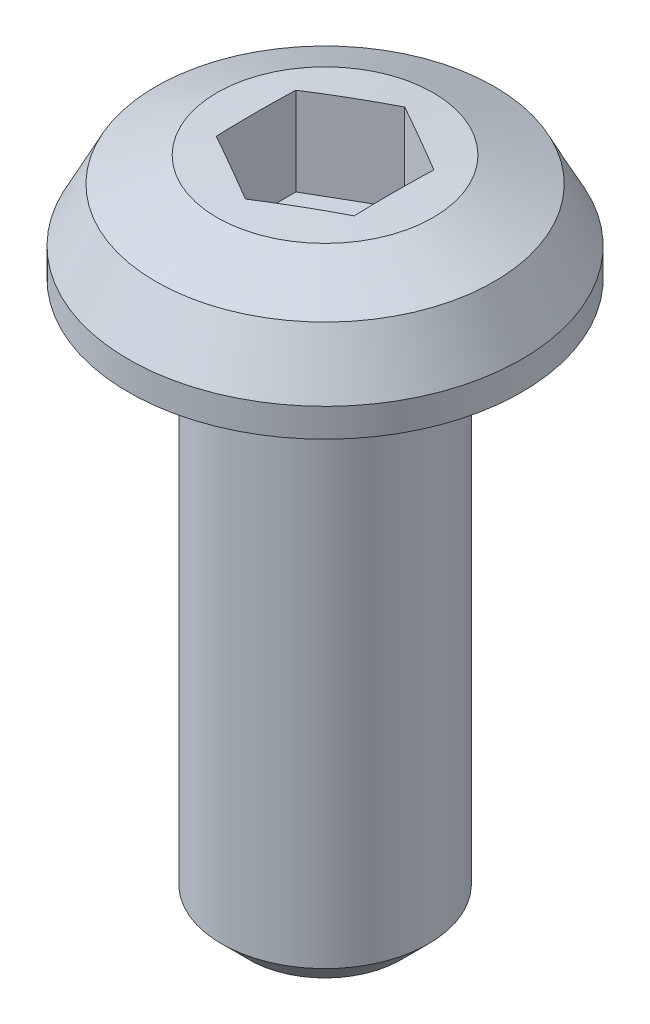
ISO-10303-21;
HEADER;
FILE_DESCRIPTION(('STEP AP214'),'2;1');
FILE_NAME('part.step','',(''),(''),'','','');
FILE_SCHEMA(('AUTOMOTIVE_DESIGN { 1 0 10303 214 1 1 1 1 }'));
ENDSEC;
DATA;
#1=APPLICATION_CONTEXT('core data for automotive mechanical design processes');
#2=APPLICATION_PROTOCOL_DEFINITION('international standard','automotive_design',2000,#1);
#3=PRODUCT_CONTEXT('',#1,'mechanical');
#4=PRODUCT('Part','Part','',(#3));
#5=PRODUCT_RELATED_PRODUCT_CATEGORY('part','',(#4));
#6=PRODUCT_DEFINITION_FORMATION('','',#4);
#7=PRODUCT_DEFINITION_CONTEXT('part definition',#1,'design');
#8=PRODUCT_DEFINITION('design','',#6,#7);
#9=PRODUCT_DEFINITION_SHAPE('','',#8);
#10=(LENGTH_UNIT() NAMED_UNIT(*) SI_UNIT(.MILLI.,.METRE.));
#11=(NAMED_UNIT(*) PLANE_ANGLE_UNIT() SI_UNIT($,.RADIAN.));
#12=(NAMED_UNIT(*) SI_UNIT($,.STERADIAN.) SOLID_ANGLE_UNIT());
#13=UNCERTAINTY_MEASURE_WITH_UNIT(LENGTH_MEASURE(1.E-05),#10,'distance_accuracy_value','');
#14=(GEOMETRIC_REPRESENTATION_CONTEXT(3) GLOBAL_UNCERTAINTY_ASSIGNED_CONTEXT((#13)) GLOBAL_UNIT_ASSIGNED_CONTEXT((#10,
#11,#12)) REPRESENTATION_CONTEXT('',''));
#15=CARTESIAN_POINT('',(0.,0.,0.));
#16=DIRECTION('',(0.,0.,1.));
#17=DIRECTION('',(1.,0.,0.));
#18=AXIS2_PLACEMENT_3D('',#15,#16,#17);
#19=CARTESIAN_POINT('',(0.,-8.,0.));
#20=DIRECTION('',(0.,-1.,0.));
#21=DIRECTION('',(0.,0.,-1.));
#22=AXIS2_PLACEMENT_3D('',#19,#20,#21);
#23=PLANE('',#22);
#24=CARTESIAN_POINT('',(0.,-8.,0.));
#25=DIRECTION('',(0.,-1.,0.));
#26=DIRECTION('',(0.,0.,-1.));
#27=AXIS2_PLACEMENT_3D('',#24,#25,#26);
#28=CIRCLE('',#27,1.1);
#29=CARTESIAN_POINT('',(0.,-8.,-1.1));
#30=VERTEX_POINT('',#29);
#31=EDGE_CURVE('E156',#30,#30,#28,.T.);
#32=ORIENTED_EDGE('',*,*,#31,.T.);
#33=EDGE_LOOP('',(#32));
#34=FACE_BOUND('',#33,.T.);
#35=ADVANCED_FACE('F41',(#34),#23,.T.);
#36=CARTESIAN_POINT('',(0.,-8.,0.));
#37=DIRECTION('',(0.,1.,0.));
#38=DIRECTION('',(0.,0.,1.));
#39=AXIS2_PLACEMENT_3D('',#36,#37,#38);
#40=CONICAL_SURFACE('',#39,1.1,0.785398163397448);
#41=CARTESIAN_POINT('',(0.,-7.6,0.));
#42=DIRECTION('',(0.,-1.,0.));
#43=DIRECTION('',(0.,0.,-1.));
#44=AXIS2_PLACEMENT_3D('',#41,#42,#43);
#45=CIRCLE('',#44,1.5);
#46=CARTESIAN_POINT('',(0.,-7.6,-1.5));
#47=VERTEX_POINT('',#46);
#48=EDGE_CURVE('E153',#47,#47,#45,.T.);
#49=ORIENTED_EDGE('',*,*,#48,.T.);
#50=EDGE_LOOP('',(#49));
#51=FACE_BOUND('',#50,.T.);
#52=ORIENTED_EDGE('',*,*,#31,.F.);
#53=EDGE_LOOP('',(#52));
#54=FACE_BOUND('',#53,.T.);
#55=ADVANCED_FACE('F193',(#51,#54),#40,.T.);
#56=CARTESIAN_POINT('',(0.,-10.,0.));
#57=DIRECTION('',(0.,-1.,0.));
#58=DIRECTION('',(0.,0.,-1.));
#59=AXIS2_PLACEMENT_3D('',#56,#57,#58);
#60=CYLINDRICAL_SURFACE('',#59,1.5);
#61=CARTESIAN_POINT('',(0.,0.,0.));
#62=DIRECTION('',(0.,-1.,0.));
#63=DIRECTION('',(0.,0.,-1.));
#64=AXIS2_PLACEMENT_3D('',#61,#62,#63);
#65=CIRCLE('',#64,1.5);
#66=CARTESIAN_POINT('',(0.,0.,-1.5));
#67=VERTEX_POINT('',#66);
#68=EDGE_CURVE('E150',#67,#67,#65,.T.);
#69=ORIENTED_EDGE('',*,*,#68,.T.);
#70=EDGE_LOOP('',(#69));
#71=FACE_BOUND('',#70,.T.);
#72=ORIENTED_EDGE('',*,*,#48,.F.);
#73=EDGE_LOOP('',(#72));
#74=FACE_BOUND('',#73,.T.);
#75=ADVANCED_FACE('F198',(#71,#74),#60,.T.);
#76=CARTESIAN_POINT('',(1.5,0.,0.));
#77=DIRECTION('',(0.,-1.,0.));
#78=DIRECTION('',(0.,0.,-1.));
#79=AXIS2_PLACEMENT_3D('',#76,#77,#78);
#80=PLANE('',#79);
#81=CARTESIAN_POINT('',(0.,0.,0.));
#82=DIRECTION('',(0.,-1.,0.));
#83=DIRECTION('',(0.,0.,-1.));
#84=AXIS2_PLACEMENT_3D('',#81,#82,#83);
#85=CIRCLE('',#84,2.85);
#86=CARTESIAN_POINT('',(0.,0.,-2.85));
#87=VERTEX_POINT('',#86);
#88=EDGE_CURVE('E147',#87,#87,#85,.T.);
#89=ORIENTED_EDGE('',*,*,#88,.T.);
#90=EDGE_LOOP('',(#89));
#91=FACE_BOUND('',#90,.T.);
#92=ORIENTED_EDGE('',*,*,#68,.F.);
#93=EDGE_LOOP('',(#92));
#94=FACE_BOUND('',#93,.T.);
#95=ADVANCED_FACE('F206',(#91,#94),#80,.T.);
#96=CARTESIAN_POINT('',(0.,-10.,0.));
#97=DIRECTION('',(0.,-1.,0.));
#98=DIRECTION('',(0.,0.,-1.));
#99=AXIS2_PLACEMENT_3D('',#96,#97,#98);
#100=CYLINDRICAL_SURFACE('',#99,2.85);
#101=CARTESIAN_POINT('',(0.,0.4125,0.));
#102=DIRECTION('',(0.,-1.,0.));
#103=DIRECTION('',(0.,0.,-1.));
#104=AXIS2_PLACEMENT_3D('',#101,#102,#103);
#105=CIRCLE('',#104,2.85);
#106=CARTESIAN_POINT('',(0.,0.4125,-2.85));
#107=VERTEX_POINT('',#106);
#108=EDGE_CURVE('E144',#107,#107,#105,.T.);
#109=ORIENTED_EDGE('',*,*,#108,.T.);
#110=EDGE_LOOP('',(#109));
#111=FACE_BOUND('',#110,.T.);
#112=ORIENTED_EDGE('',*,*,#88,.F.);
#113=EDGE_LOOP('',(#112));
#114=FACE_BOUND('',#113,.T.);
#115=ADVANCED_FACE('F212',(#111,#114),#100,.T.);
#116=CARTESIAN_POINT('',(0.,0.4125,0.));
#117=DIRECTION('',(0.,-1.,0.));
#118=DIRECTION('',(0.,0.,-1.));
#119=AXIS2_PLACEMENT_3D('',#116,#117,#118);
#120=CONICAL_SURFACE('',#119,2.85,0.475185558518265);
#121=CARTESIAN_POINT('',(0.,1.188,0.));
#122=DIRECTION('',(0.,-1.,0.));
#123=DIRECTION('',(0.,0.,-1.));
#124=AXIS2_PLACEMENT_3D('',#121,#122,#123);
#125=CIRCLE('',#124,2.451);
#126=CARTESIAN_POINT('',(0.,1.188,-2.451));
#127=VERTEX_POINT('',#126);
#128=EDGE_CURVE('E141',#127,#127,#125,.T.);
#129=ORIENTED_EDGE('',*,*,#128,.T.);
#130=EDGE_LOOP('',(#129));
#131=FACE_BOUND('',#130,.T.);
#132=ORIENTED_EDGE('',*,*,#108,.F.);
#133=EDGE_LOOP('',(#132));
#134=FACE_BOUND('',#133,.T.);
#135=ADVANCED_FACE('F216',(#131,#134),#120,.T.);
#136=CARTESIAN_POINT('',(0.,1.188,0.));
#137=DIRECTION('',(0.,-1.,0.));
#138=DIRECTION('',(0.,0.,-1.));
#139=AXIS2_PLACEMENT_3D('',#136,#137,#138);
#140=CONICAL_SURFACE('',#139,2.451,1.18095805376664);
#141=CARTESIAN_POINT('',(0.,1.551,0.));
#142=DIRECTION('',(0.,-1.,0.));
#143=DIRECTION('',(0.,0.,-1.));
#144=AXIS2_PLACEMENT_3D('',#141,#142,#143);
#145=CIRCLE('',#144,1.5675);
#146=CARTESIAN_POINT('',(0.,1.551,-1.5675));
#147=VERTEX_POINT('',#146);
#148=EDGE_CURVE('E129',#147,#147,#145,.T.);
#149=ORIENTED_EDGE('',*,*,#148,.T.);
#150=EDGE_LOOP('',(#149));
#151=FACE_BOUND('',#150,.T.);
#152=ORIENTED_EDGE('',*,*,#128,.F.);
#153=EDGE_LOOP('',(#152));
#154=FACE_BOUND('',#153,.T.);
#155=ADVANCED_FACE('F190',(#151,#154),#140,.T.);
#156=CARTESIAN_POINT('',(0.,1.551,0.));
#157=DIRECTION('',(0.,-1.,0.));
#158=DIRECTION('',(0.,0.,-1.));
#159=AXIS2_PLACEMENT_3D('',#156,#157,#158);
#160=CONICAL_SURFACE('',#159,1.5675,1.50772220889798);
#161=CARTESIAN_POINT('',(1.,1.5234414897962,1.73648699452597));
#162=CARTESIAN_POINT('',(1.,1.52800738665714,1.65295465629629));
#163=CARTESIAN_POINT('',(1.,1.53250258503321,1.5694183439422));
#164=CARTESIAN_POINT('',(1.,1.5412607258875,1.40233259634458));
#165=CARTESIAN_POINT('',(1.,1.54552366561768,1.31878316095751));
#166=CARTESIAN_POINT('',(1.,1.55372843546733,1.15162482741926));
#167=CARTESIAN_POINT('',(1.,1.55767009865963,1.06801592083902));
#168=CARTESIAN_POINT('',(1.,1.56508058046788,0.900777623975783));
#169=CARTESIAN_POINT('',(1.,1.5685493973109,0.817148233617164));
#170=CARTESIAN_POINT('',(1.,1.57791126672824,0.566479665732185));
#171=CARTESIAN_POINT('',(1.,1.58277403214756,0.399394734543162));
#172=CARTESIAN_POINT('',(1.,1.58635386968313,0.148731703092964));
#173=CARTESIAN_POINT('',(1.,1.58692824905782,0.0651813267160948));
#174=CARTESIAN_POINT('',(1.,1.58673465415988,-0.101917912099061));
#175=CARTESIAN_POINT('',(1.,1.58596667777848,-0.185466774534764));
#176=CARTESIAN_POINT('',(1.,1.58259127587955,-0.391313209892518));
#177=CARTESIAN_POINT('',(1.,1.5792955868849,-0.513598960117818));
#178=CARTESIAN_POINT('',(1.,1.57101491922684,-0.758130793702921));
#179=CARTESIAN_POINT('',(1.,1.56602962972694,-0.880376865617957));
#180=CARTESIAN_POINT('',(1.,1.55509396253754,-1.12496911050028));
#181=CARTESIAN_POINT('',(1.,1.54914245256463,-1.24731523128819));
#182=CARTESIAN_POINT('',(1.,1.53664597969702,-1.49193921843679));
#183=CARTESIAN_POINT('',(1.,1.53010120238364,-1.6142170941853));
#184=CARTESIAN_POINT('',(1.,1.5234414897962,-1.73648699452597));
#185=B_SPLINE_CURVE_WITH_KNOTS('',3,(#161,#162,#163,#164,#165,#166,#167,#168,#169,#170,#171,
#172,#173,#174,#175,#176,#177,#178,#179,#180,#181,#182,#183,#184),.UNSPECIFIED.,.F.,.F.,(4,2,2,
2,2,2,2,2,2,2,2,4),(0.,0.250971165367378,0.501945299527714,0.753049013116727,1.00415366818482,
1.50556578331992,1.75621242235346,2.00685945514112,2.3738292511687,2.74086659546051,
3.10833720585524,3.4756932610088),.UNSPECIFIED.);
#186=CARTESIAN_POINT('',(1.,1.57707154494447,0.577350269189626));
#187=VERTEX_POINT('',#186);
#188=CARTESIAN_POINT('',(1.,1.57707154494447,-0.577350269189625));
#189=VERTEX_POINT('',#188);
#190=EDGE_CURVE('E11',#187,#189,#185,.T.);
#191=ORIENTED_EDGE('',*,*,#190,.F.);
#192=CARTESIAN_POINT('',(-0.000199999999999929,1.57706425100515,1.15481600843309));
#193=CARTESIAN_POINT('',(0.0831485593941857,1.58014109035697,1.10669469523029));
#194=CARTESIAN_POINT('',(0.166519676411975,1.58258581405264,1.05856035837743));
#195=CARTESIAN_POINT('',(0.33326053326811,1.58593610072931,0.96229247978663));
#196=CARTESIAN_POINT('',(0.416630266634055,1.58684210526316,0.914158941785534));
#197=CARTESIAN_POINT('',(0.583369733365945,1.58684210526316,0.817891865783343));
#198=CARTESIAN_POINT('',(0.66673946673189,1.58593610072931,0.769758327782248));
#199=CARTESIAN_POINT('',(0.833480323588025,1.58258581405264,0.673490449191449));
#200=CARTESIAN_POINT('',(0.916851440605815,1.58014109035697,0.625356112338588));
#201=CARTESIAN_POINT('',(1.0002,1.57706425100515,0.577234799135788));
#202=B_SPLINE_CURVE_WITH_KNOTS('',3,(#192,#193,#194,#195,#196,#197,#198,#199,#200,#201),
.UNSPECIFIED.,.F.,.F.,(4,2,2,2,4),(0.,0.288882658444228,0.57768240473039,0.866482151016552,
1.15536480946078),.UNSPECIFIED.);
#203=CARTESIAN_POINT('',(0.,1.57707154494447,1.15470053837925));
#204=VERTEX_POINT('',#203);
#205=EDGE_CURVE('E54',#204,#187,#202,.T.);
#206=ORIENTED_EDGE('',*,*,#205,.F.);
#207=CARTESIAN_POINT('',(-1.0002,1.57706425100515,0.577234799135788));
#208=CARTESIAN_POINT('',(-0.916851440605814,1.58014109035697,0.625356112338589));
#209=CARTESIAN_POINT('',(-0.833480323588025,1.58258581405264,0.673490449191449));
#210=CARTESIAN_POINT('',(-0.666739466731889,1.58593610072931,0.769758327782248));
#211=CARTESIAN_POINT('',(-0.583369733365945,1.58684210526316,0.817891865783343));
#212=CARTESIAN_POINT('',(-0.416630266634055,1.58684210526316,0.914158941785534));
#213=CARTESIAN_POINT('',(-0.33326053326811,1.58593610072931,0.96229247978663));
#214=CARTESIAN_POINT('',(-0.166519676411975,1.58258581405264,1.05856035837743));
#215=CARTESIAN_POINT('',(-0.0831485593941853,1.58014109035697,1.10669469523029));
#216=CARTESIAN_POINT('',(0.000200000000000079,1.57706425100515,1.15481600843309));
#217=B_SPLINE_CURVE_WITH_KNOTS('',3,(#207,#208,#209,#210,#211,#212,#213,#214,#215,#216),
.UNSPECIFIED.,.F.,.F.,(4,2,2,2,4),(0.,0.288882658444228,0.57768240473039,0.866482151016551,
1.15536480946078),.UNSPECIFIED.);
#218=CARTESIAN_POINT('',(-1.,1.57707154494447,0.577350269189626));
#219=VERTEX_POINT('',#218);
#220=EDGE_CURVE('E304',#219,#204,#217,.T.);
#221=ORIENTED_EDGE('',*,*,#220,.F.);
#222=CARTESIAN_POINT('',(-1.,1.5234414897962,-1.73648699452597));
#223=CARTESIAN_POINT('',(-1.,1.52800738665714,-1.65295465629629));
#224=CARTESIAN_POINT('',(-1.,1.53250258503321,-1.5694183439422));
#225=CARTESIAN_POINT('',(-1.,1.5412607258875,-1.40233259634458));
#226=CARTESIAN_POINT('',(-1.,1.54552366561768,-1.31878316095751));
#227=CARTESIAN_POINT('',(-1.,1.55372843546733,-1.15162482741926));
#228=CARTESIAN_POINT('',(-1.,1.55767009865963,-1.06801592083902));
#229=CARTESIAN_POINT('',(-1.,1.56508058046788,-0.900777623975783));
#230=CARTESIAN_POINT('',(-1.,1.5685493973109,-0.817148233617164));
#231=CARTESIAN_POINT('',(-1.,1.57791126672824,-0.566479665732185));
#232=CARTESIAN_POINT('',(-1.,1.58277403214756,-0.399394734543162));
#233=CARTESIAN_POINT('',(-1.,1.58635386968313,-0.148731703092964));
#234=CARTESIAN_POINT('',(-1.,1.58692824905782,-0.065181326716095));
#235=CARTESIAN_POINT('',(-1.,1.58673465415988,0.101917912099061));
#236=CARTESIAN_POINT('',(-1.,1.58596667777848,0.185466774534764));
#237=CARTESIAN_POINT('',(-1.,1.58259127587955,0.391313209892518));
#238=CARTESIAN_POINT('',(-1.,1.5792955868849,0.513598960117818));
#239=CARTESIAN_POINT('',(-1.,1.57101491922684,0.758130793702922));
#240=CARTESIAN_POINT('',(-1.,1.56602962972694,0.880376865617957));
#241=CARTESIAN_POINT('',(-1.,1.55509396253754,1.12496911050029));
#242=CARTESIAN_POINT('',(-1.,1.54914245256463,1.24731523128819));
#243=CARTESIAN_POINT('',(-1.,1.53664597969702,1.49193921843679));
#244=CARTESIAN_POINT('',(-1.,1.53010120238364,1.6142170941853));
#245=CARTESIAN_POINT('',(-0.999999999999999,1.5234414897962,1.73648699452597));
#246=B_SPLINE_CURVE_WITH_KNOTS('',3,(#222,#223,#224,#225,#226,#227,#228,#229,#230,#231,#232,
#233,#234,#235,#236,#237,#238,#239,#240,#241,#242,#243,#244,#245),.UNSPECIFIED.,.F.,.F.,(4,2,2,
2,2,2,2,2,2,2,2,4),(0.,0.250971165367378,0.501945299527714,0.753049013116727,1.00415366818482,
1.50556578331992,1.75621242235346,2.00685945514112,2.3738292511687,2.74086659546051,
3.10833720585524,3.4756932610088),.UNSPECIFIED.);
#247=CARTESIAN_POINT('',(-1.,1.57707154494447,-0.577350269189626));
#248=VERTEX_POINT('',#247);
#249=EDGE_CURVE('E309',#248,#219,#246,.T.);
#250=ORIENTED_EDGE('',*,*,#249,.F.);
#251=CARTESIAN_POINT('',(0.000199999999999788,1.57706425100515,-1.15481600843309));
#252=CARTESIAN_POINT('',(-0.0831485593941856,1.58014109035697,-1.10669469523029));
#253=CARTESIAN_POINT('',(-0.166519676411975,1.58258581405264,-1.05856035837743));
#254=CARTESIAN_POINT('',(-0.333260533268111,1.58593610072931,-0.96229247978663));
#255=CARTESIAN_POINT('',(-0.416630266634055,1.58684210526316,-0.914158941785534));
#256=CARTESIAN_POINT('',(-0.583369733365945,1.58684210526316,-0.817891865783343));
#257=CARTESIAN_POINT('',(-0.66673946673189,1.58593610072931,-0.769758327782248));
#258=CARTESIAN_POINT('',(-0.833480323588025,1.58258581405264,-0.673490449191449));
#259=CARTESIAN_POINT('',(-0.916851440605815,1.58014109035697,-0.625356112338588));
#260=CARTESIAN_POINT('',(-1.0002,1.57706425100515,-0.577234799135788));
#261=B_SPLINE_CURVE_WITH_KNOTS('',3,(#251,#252,#253,#254,#255,#256,#257,#258,#259,#260),
.UNSPECIFIED.,.F.,.F.,(4,2,2,2,4),(0.,0.288882658444228,0.57768240473039,0.866482151016552,
1.15536480946078),.UNSPECIFIED.);
#262=CARTESIAN_POINT('',(0.,1.57707154494447,-1.15470053837925));
#263=VERTEX_POINT('',#262);
#264=EDGE_CURVE('E166',#263,#248,#261,.T.);
#265=ORIENTED_EDGE('',*,*,#264,.F.);
#266=CARTESIAN_POINT('',(1.0002,1.57706425100515,-0.577234799135788));
#267=CARTESIAN_POINT('',(0.916851440605815,1.58014109035697,-0.625356112338588));
#268=CARTESIAN_POINT('',(0.833480323588025,1.58258581405264,-0.673490449191449));
#269=CARTESIAN_POINT('',(0.66673946673189,1.58593610072931,-0.769758327782247));
#270=CARTESIAN_POINT('',(0.583369733365945,1.58684210526316,-0.817891865783343));
#271=CARTESIAN_POINT('',(0.416630266634055,1.58684210526316,-0.914158941785534));
#272=CARTESIAN_POINT('',(0.33326053326811,1.58593610072931,-0.96229247978663));
#273=CARTESIAN_POINT('',(0.166519676411975,1.58258581405264,-1.05856035837743));
#274=CARTESIAN_POINT('',(0.0831485593941856,1.58014109035697,-1.10669469523029));
#275=CARTESIAN_POINT('',(-0.000199999999999905,1.57706425100515,-1.15481600843309));
#276=B_SPLINE_CURVE_WITH_KNOTS('',3,(#266,#267,#268,#269,#270,#271,#272,#273,#274,#275),
.UNSPECIFIED.,.F.,.F.,(4,2,2,2,4),(0.,0.288882658444229,0.57768240473039,0.866482151016552,
1.15536480946078),.UNSPECIFIED.);
#277=EDGE_CURVE('E159',#189,#263,#276,.T.);
#278=ORIENTED_EDGE('',*,*,#277,.F.);
#279=EDGE_LOOP('',(#191,#206,#221,#250,#265,#278));
#280=FACE_BOUND('',#279,.T.);
#281=ORIENTED_EDGE('',*,*,#148,.F.);
#282=EDGE_LOOP('',(#281));
#283=FACE_BOUND('',#282,.T.);
#284=ADVANCED_FACE('F173',(#280,#283),#160,.T.);
#285=CARTESIAN_POINT('',(1.,0.3,-0.577350269189625));
#286=DIRECTION('',(1.,0.,0.));
#287=DIRECTION('',(0.,0.,-1.));
#288=AXIS2_PLACEMENT_3D('',#285,#286,#287);
#289=PLANE('',#288);
#290=ORIENTED_EDGE('',*,*,#190,.T.);
#291=DIRECTION('',(0.,1.,0.));
#292=VECTOR('',#291,1.);
#293=CARTESIAN_POINT('',(1.,0.3,-0.577350269189625));
#294=LINE('',#293,#292);
#295=CARTESIAN_POINT('',(1.,0.3,-0.577350269189625));
#296=VERTEX_POINT('',#295);
#297=EDGE_CURVE('E61',#296,#189,#294,.T.);
#298=ORIENTED_EDGE('',*,*,#297,.F.);
#299=DIRECTION('',(0.,0.,-1.));
#300=VECTOR('',#299,1.);
#301=CARTESIAN_POINT('',(1.,0.3,-0.577350269189625));
#302=LINE('',#301,#300);
#303=CARTESIAN_POINT('',(1.,0.3,0.577350269189626));
#304=VERTEX_POINT('',#303);
#305=EDGE_CURVE('E99',#304,#296,#302,.T.);
#306=ORIENTED_EDGE('',*,*,#305,.F.);
#307=DIRECTION('',(0.,1.,0.));
#308=VECTOR('',#307,1.);
#309=CARTESIAN_POINT('',(1.,0.3,0.577350269189626));
#310=LINE('',#309,#308);
#311=EDGE_CURVE('E127',#304,#187,#310,.T.);
#312=ORIENTED_EDGE('',*,*,#311,.T.);
#313=EDGE_LOOP('',(#290,#298,#306,#312));
#314=FACE_BOUND('',#313,.T.);
#315=ADVANCED_FACE('F97',(#314),#289,.F.);
#316=CARTESIAN_POINT('',(1.,0.3,0.577350269189626));
#317=DIRECTION('',(0.5,0.,0.866025403784439));
#318=DIRECTION('',(0.866025403784439,0.,-0.5));
#319=AXIS2_PLACEMENT_3D('',#316,#317,#318);
#320=PLANE('',#319);
#321=ORIENTED_EDGE('',*,*,#205,.T.);
#322=ORIENTED_EDGE('',*,*,#311,.F.);
#323=DIRECTION('',(0.866025403784439,0.,-0.5));
#324=VECTOR('',#323,1.);
#325=CARTESIAN_POINT('',(1.,0.3,0.577350269189626));
#326=LINE('',#325,#324);
#327=CARTESIAN_POINT('',(0.,0.3,1.15470053837925));
#328=VERTEX_POINT('',#327);
#329=EDGE_CURVE('E104',#328,#304,#326,.T.);
#330=ORIENTED_EDGE('',*,*,#329,.F.);
#331=DIRECTION('',(0.,1.,0.));
#332=VECTOR('',#331,1.);
#333=CARTESIAN_POINT('',(0.,0.3,1.15470053837925));
#334=LINE('',#333,#332);
#335=EDGE_CURVE('E130',#328,#204,#334,.T.);
#336=ORIENTED_EDGE('',*,*,#335,.T.);
#337=EDGE_LOOP('',(#321,#322,#330,#336));
#338=FACE_BOUND('',#337,.T.);
#339=ADVANCED_FACE('F183',(#338),#320,.F.);
#340=CARTESIAN_POINT('',(0.,0.3,1.15470053837925));
#341=DIRECTION('',(-0.5,0.,0.866025403784439));
#342=DIRECTION('',(0.866025403784439,0.,0.5));
#343=AXIS2_PLACEMENT_3D('',#340,#341,#342);
#344=PLANE('',#343);
#345=ORIENTED_EDGE('',*,*,#220,.T.);
#346=ORIENTED_EDGE('',*,*,#335,.F.);
#347=DIRECTION('',(0.866025403784439,0.,0.5));
#348=VECTOR('',#347,1.);
#349=CARTESIAN_POINT('',(0.,0.3,1.15470053837925));
#350=LINE('',#349,#348);
#351=CARTESIAN_POINT('',(-1.,0.3,0.577350269189626));
#352=VERTEX_POINT('',#351);
#353=EDGE_CURVE('E124',#352,#328,#350,.T.);
#354=ORIENTED_EDGE('',*,*,#353,.F.);
#355=DIRECTION('',(0.,1.,0.));
#356=VECTOR('',#355,1.);
#357=CARTESIAN_POINT('',(-1.,0.3,0.577350269189626));
#358=LINE('',#357,#356);
#359=EDGE_CURVE('E132',#352,#219,#358,.T.);
#360=ORIENTED_EDGE('',*,*,#359,.T.);
#361=EDGE_LOOP('',(#345,#346,#354,#360));
#362=FACE_BOUND('',#361,.T.);
#363=ADVANCED_FACE('F188',(#362),#344,.F.);
#364=CARTESIAN_POINT('',(-1.,0.3,0.577350269189626));
#365=DIRECTION('',(-1.,0.,0.));
#366=DIRECTION('',(0.,0.,1.));
#367=AXIS2_PLACEMENT_3D('',#364,#365,#366);
#368=PLANE('',#367);
#369=ORIENTED_EDGE('',*,*,#249,.T.);
#370=ORIENTED_EDGE('',*,*,#359,.F.);
#371=DIRECTION('',(0.,0.,1.));
#372=VECTOR('',#371,1.);
#373=CARTESIAN_POINT('',(-1.,0.3,0.577350269189626));
#374=LINE('',#373,#372);
#375=CARTESIAN_POINT('',(-1.,0.3,-0.577350269189626));
#376=VERTEX_POINT('',#375);
#377=EDGE_CURVE('E121',#376,#352,#374,.T.);
#378=ORIENTED_EDGE('',*,*,#377,.F.);
#379=DIRECTION('',(0.,1.,0.));
#380=VECTOR('',#379,1.);
#381=CARTESIAN_POINT('',(-1.,0.3,-0.577350269189626));
#382=LINE('',#381,#380);
#383=EDGE_CURVE('E135',#376,#248,#382,.T.);
#384=ORIENTED_EDGE('',*,*,#383,.T.);
#385=EDGE_LOOP('',(#369,#370,#378,#384));
#386=FACE_BOUND('',#385,.T.);
#387=ADVANCED_FACE('F263',(#386),#368,.F.);
#388=CARTESIAN_POINT('',(-1.,0.3,-0.577350269189626));
#389=DIRECTION('',(-0.5,0.,-0.866025403784438));
#390=DIRECTION('',(-0.866025403784439,0.,0.5));
#391=AXIS2_PLACEMENT_3D('',#388,#389,#390);
#392=PLANE('',#391);
#393=ORIENTED_EDGE('',*,*,#264,.T.);
#394=ORIENTED_EDGE('',*,*,#383,.F.);
#395=DIRECTION('',(-0.866025403784439,0.,0.5));
#396=VECTOR('',#395,1.);
#397=CARTESIAN_POINT('',(-1.,0.3,-0.577350269189626));
#398=LINE('',#397,#396);
#399=CARTESIAN_POINT('',(0.,0.3,-1.15470053837925));
#400=VERTEX_POINT('',#399);
#401=EDGE_CURVE('E113',#400,#376,#398,.T.);
#402=ORIENTED_EDGE('',*,*,#401,.F.);
#403=DIRECTION('',(0.,1.,0.));
#404=VECTOR('',#403,1.);
#405=CARTESIAN_POINT('',(0.,0.3,-1.15470053837925));
#406=LINE('',#405,#404);
#407=EDGE_CURVE('E103',#400,#263,#406,.T.);
#408=ORIENTED_EDGE('',*,*,#407,.T.);
#409=EDGE_LOOP('',(#393,#394,#402,#408));
#410=FACE_BOUND('',#409,.T.);
#411=ADVANCED_FACE('F178',(#410),#392,.F.);
#412=CARTESIAN_POINT('',(0.,0.3,-1.15470053837925));
#413=DIRECTION('',(0.5,0.,-0.866025403784439));
#414=DIRECTION('',(-0.866025403784438,0.,-0.5));
#415=AXIS2_PLACEMENT_3D('',#412,#413,#414);
#416=PLANE('',#415);
#417=ORIENTED_EDGE('',*,*,#277,.T.);
#418=ORIENTED_EDGE('',*,*,#407,.F.);
#419=DIRECTION('',(-0.866025403784438,0.,-0.5));
#420=VECTOR('',#419,1.);
#421=CARTESIAN_POINT('',(0.,0.3,-1.15470053837925));
#422=LINE('',#421,#420);
#423=EDGE_CURVE('E107',#296,#400,#422,.T.);
#424=ORIENTED_EDGE('',*,*,#423,.F.);
#425=ORIENTED_EDGE('',*,*,#297,.T.);
#426=EDGE_LOOP('',(#417,#418,#424,#425));
#427=FACE_BOUND('',#426,.T.);
#428=ADVANCED_FACE('F108',(#427),#416,.F.);
#429=CARTESIAN_POINT('',(0.,0.3,0.));
#430=DIRECTION('',(0.,-1.,0.));
#431=DIRECTION('',(0.,0.,-1.));
#432=AXIS2_PLACEMENT_3D('',#429,#430,#431);
#433=PLANE('',#432);
#434=ORIENTED_EDGE('',*,*,#305,.T.);
#435=ORIENTED_EDGE('',*,*,#423,.T.);
#436=ORIENTED_EDGE('',*,*,#401,.T.);
#437=ORIENTED_EDGE('',*,*,#377,.T.);
#438=ORIENTED_EDGE('',*,*,#353,.T.);
#439=ORIENTED_EDGE('',*,*,#329,.T.);
#440=EDGE_LOOP('',(#434,#435,#436,#437,#438,#439));
#441=FACE_BOUND('',#440,.T.);
#442=ADVANCED_FACE('F115',(#441),#433,.F.);
#443=CLOSED_SHELL('',(#35,#55,#75,#95,#115,#135,#155,#284,#315,#339,#363,#387,#411,#428,#442));
#444=MANIFOLD_SOLID_BREP('B2',#443);
#445=ADVANCED_BREP_SHAPE_REPRESENTATION('',(#18,#444),#14);
#446=SHAPE_DEFINITION_REPRESENTATION(#9,#445);
ENDSEC;
END-ISO-10303-21;
